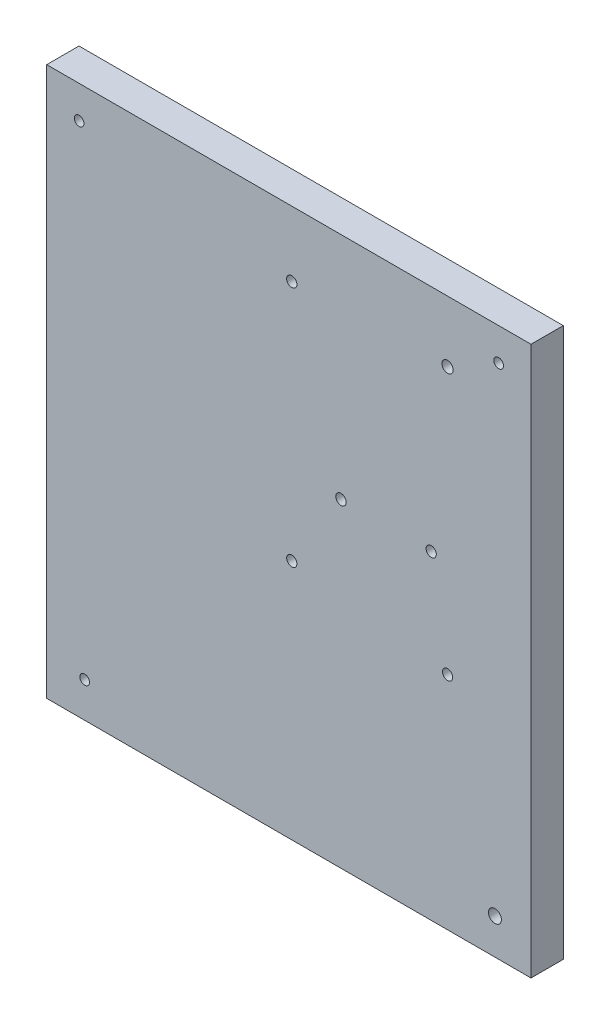
ISO-10303-21;
HEADER;
FILE_DESCRIPTION(('STEP AP214'),'2;1');
FILE_NAME('part.step','',(''),(''),'','','');
FILE_SCHEMA(('AUTOMOTIVE_DESIGN { 1 0 10303 214 1 1 1 1 }'));
ENDSEC;
DATA;
#1=APPLICATION_CONTEXT('core data for automotive mechanical design processes');
#2=APPLICATION_PROTOCOL_DEFINITION('international standard','automotive_design',2000,#1);
#3=PRODUCT_CONTEXT('',#1,'mechanical');
#4=PRODUCT('Part','Part','',(#3));
#5=PRODUCT_RELATED_PRODUCT_CATEGORY('part','',(#4));
#6=PRODUCT_DEFINITION_FORMATION('','',#4);
#7=PRODUCT_DEFINITION_CONTEXT('part definition',#1,'design');
#8=PRODUCT_DEFINITION('design','',#6,#7);
#9=PRODUCT_DEFINITION_SHAPE('','',#8);
#10=(LENGTH_UNIT() NAMED_UNIT(*) SI_UNIT(.MILLI.,.METRE.));
#11=(NAMED_UNIT(*) PLANE_ANGLE_UNIT() SI_UNIT($,.RADIAN.));
#12=(NAMED_UNIT(*) SI_UNIT($,.STERADIAN.) SOLID_ANGLE_UNIT());
#13=UNCERTAINTY_MEASURE_WITH_UNIT(LENGTH_MEASURE(1.E-05),#10,'distance_accuracy_value','');
#14=(GEOMETRIC_REPRESENTATION_CONTEXT(3) GLOBAL_UNCERTAINTY_ASSIGNED_CONTEXT((#13)) GLOBAL_UNIT_ASSIGNED_CONTEXT((#10,
#11,#12)) REPRESENTATION_CONTEXT('',''));
#15=CARTESIAN_POINT('',(0.,0.,0.));
#16=DIRECTION('',(0.,0.,1.));
#17=DIRECTION('',(1.,0.,0.));
#18=AXIS2_PLACEMENT_3D('',#15,#16,#17);
#19=CARTESIAN_POINT('',(0.,0.,10.));
#20=DIRECTION('',(0.,0.,-1.));
#21=DIRECTION('',(-1.,0.,0.));
#22=AXIS2_PLACEMENT_3D('',#19,#20,#21);
#23=PLANE('',#22);
#24=CARTESIAN_POINT('',(124.162413192592,68.48,10.));
#25=DIRECTION('',(0.,0.,-1.));
#26=DIRECTION('',(-1.,0.,0.));
#27=AXIS2_PLACEMENT_3D('',#24,#25,#26);
#28=CIRCLE('',#27,1.58750000000003);
#29=CARTESIAN_POINT('',(122.574913192592,68.48,10.));
#30=VERTEX_POINT('',#29);
#31=EDGE_CURVE('E158',#30,#30,#28,.F.);
#32=ORIENTED_EDGE('',*,*,#31,.F.);
#33=EDGE_LOOP('',(#32));
#34=FACE_BOUND('',#33,.T.);
#35=CARTESIAN_POINT('',(119.082413192592,98.96,10.));
#36=DIRECTION('',(0.,0.,-1.));
#37=DIRECTION('',(-1.,0.,0.));
#38=AXIS2_PLACEMENT_3D('',#35,#36,#37);
#39=CIRCLE('',#38,1.58750000000001);
#40=CARTESIAN_POINT('',(117.494913192592,98.96,10.));
#41=VERTEX_POINT('',#40);
#42=EDGE_CURVE('E146',#41,#41,#39,.F.);
#43=ORIENTED_EDGE('',*,*,#42,.F.);
#44=EDGE_LOOP('',(#43));
#45=FACE_BOUND('',#44,.T.);
#46=CARTESIAN_POINT('',(75.9024131925925,149.76,10.));
#47=DIRECTION('',(0.,0.,-1.));
#48=DIRECTION('',(-1.,0.,0.));
#49=AXIS2_PLACEMENT_3D('',#46,#47,#48);
#50=CIRCLE('',#49,1.58749999999999);
#51=CARTESIAN_POINT('',(74.3149131925925,149.76,10.));
#52=VERTEX_POINT('',#51);
#53=EDGE_CURVE('E134',#52,#52,#50,.F.);
#54=ORIENTED_EDGE('',*,*,#53,.F.);
#55=EDGE_LOOP('',(#54));
#56=FACE_BOUND('',#55,.T.);
#57=CARTESIAN_POINT('',(138.83014603639,11.0362916621417,10.));
#58=DIRECTION('',(0.,0.,-1.));
#59=DIRECTION('',(-1.,0.,0.));
#60=AXIS2_PLACEMENT_3D('',#57,#58,#59);
#61=CIRCLE('',#60,1.99760493715462);
#62=CARTESIAN_POINT('',(136.832541099236,11.0362916621417,10.));
#63=VERTEX_POINT('',#62);
#64=EDGE_CURVE('E122',#63,#63,#61,.F.);
#65=ORIENTED_EDGE('',*,*,#64,.F.);
#66=EDGE_LOOP('',(#65));
#67=FACE_BOUND('',#66,.T.);
#68=CARTESIAN_POINT('',(10.0330293163896,159.940212919892,10.));
#69=DIRECTION('',(0.,0.,-1.));
#70=DIRECTION('',(-1.,0.,0.));
#71=AXIS2_PLACEMENT_3D('',#68,#69,#70);
#72=CIRCLE('',#71,1.5);
#73=CARTESIAN_POINT('',(8.53302931638961,159.940212919892,10.));
#74=VERTEX_POINT('',#73);
#75=EDGE_CURVE('E99',#74,#74,#72,.F.);
#76=ORIENTED_EDGE('',*,*,#75,.F.);
#77=EDGE_LOOP('',(#76));
#78=FACE_BOUND('',#77,.T.);
#79=DIRECTION('',(0.,-1.,0.));
#80=VECTOR('',#79,1.);
#81=CARTESIAN_POINT('',(0.,0.,10.));
#82=LINE('',#81,#80);
#83=CARTESIAN_POINT('',(0.,170.,10.));
#84=VERTEX_POINT('',#83);
#85=CARTESIAN_POINT('',(0.,0.,10.));
#86=VERTEX_POINT('',#85);
#87=EDGE_CURVE('E84',#84,#86,#82,.T.);
#88=ORIENTED_EDGE('',*,*,#87,.T.);
#89=DIRECTION('',(1.,0.,0.));
#90=VECTOR('',#89,1.);
#91=CARTESIAN_POINT('',(0.,0.,10.));
#92=LINE('',#91,#90);
#93=CARTESIAN_POINT('',(150.,0.,10.));
#94=VERTEX_POINT('',#93);
#95=EDGE_CURVE('E79',#86,#94,#92,.T.);
#96=ORIENTED_EDGE('',*,*,#95,.T.);
#97=DIRECTION('',(0.,1.,0.));
#98=VECTOR('',#97,1.);
#99=CARTESIAN_POINT('',(150.,0.,10.));
#100=LINE('',#99,#98);
#101=CARTESIAN_POINT('',(150.,170.,10.));
#102=VERTEX_POINT('',#101);
#103=EDGE_CURVE('E82',#94,#102,#100,.T.);
#104=ORIENTED_EDGE('',*,*,#103,.T.);
#105=DIRECTION('',(-1.,0.,0.));
#106=VECTOR('',#105,1.);
#107=CARTESIAN_POINT('',(0.,170.,10.));
#108=LINE('',#107,#106);
#109=EDGE_CURVE('E49',#102,#84,#108,.T.);
#110=ORIENTED_EDGE('',*,*,#109,.T.);
#111=EDGE_LOOP('',(#88,#96,#104,#110));
#112=FACE_BOUND('',#111,.T.);
#113=CARTESIAN_POINT('',(139.978914047077,159.940212919892,10.));
#114=DIRECTION('',(0.,0.,-1.));
#115=DIRECTION('',(-1.,0.,0.));
#116=AXIS2_PLACEMENT_3D('',#113,#114,#115);
#117=CIRCLE('',#116,1.5);
#118=CARTESIAN_POINT('',(138.478914047077,159.940212919892,10.));
#119=VERTEX_POINT('',#118);
#120=EDGE_CURVE('E116',#119,#119,#117,.F.);
#121=ORIENTED_EDGE('',*,*,#120,.F.);
#122=EDGE_LOOP('',(#121));
#123=FACE_BOUND('',#122,.T.);
#124=CARTESIAN_POINT('',(11.7556994308777,10.9268338372165,10.));
#125=DIRECTION('',(0.,0.,-1.));
#126=DIRECTION('',(-1.,0.,0.));
#127=AXIS2_PLACEMENT_3D('',#124,#125,#126);
#128=CIRCLE('',#127,1.5);
#129=CARTESIAN_POINT('',(10.2556994308777,10.9268338372165,10.));
#130=VERTEX_POINT('',#129);
#131=EDGE_CURVE('E128',#130,#130,#128,.F.);
#132=ORIENTED_EDGE('',*,*,#131,.F.);
#133=EDGE_LOOP('',(#132));
#134=FACE_BOUND('',#133,.T.);
#135=CARTESIAN_POINT('',(124.162413192592,151.03,10.));
#136=DIRECTION('',(0.,0.,-1.));
#137=DIRECTION('',(-1.,0.,0.));
#138=AXIS2_PLACEMENT_3D('',#135,#136,#137);
#139=CIRCLE('',#138,1.73833982041641);
#140=CARTESIAN_POINT('',(122.424073372176,151.03,10.));
#141=VERTEX_POINT('',#140);
#142=EDGE_CURVE('E140',#141,#141,#139,.F.);
#143=ORIENTED_EDGE('',*,*,#142,.F.);
#144=EDGE_LOOP('',(#143));
#145=FACE_BOUND('',#144,.T.);
#146=CARTESIAN_POINT('',(91.1424131925924,98.96,10.));
#147=DIRECTION('',(0.,0.,-1.));
#148=DIRECTION('',(-1.,0.,0.));
#149=AXIS2_PLACEMENT_3D('',#146,#147,#148);
#150=CIRCLE('',#149,1.6200555073619);
#151=CARTESIAN_POINT('',(89.5223576852305,98.96,10.));
#152=VERTEX_POINT('',#151);
#153=EDGE_CURVE('E152',#152,#152,#150,.F.);
#154=ORIENTED_EDGE('',*,*,#153,.F.);
#155=EDGE_LOOP('',(#154));
#156=FACE_BOUND('',#155,.T.);
#157=CARTESIAN_POINT('',(75.9024131925925,74.83,10.));
#158=DIRECTION('',(0.,0.,-1.));
#159=DIRECTION('',(-1.,0.,0.));
#160=AXIS2_PLACEMENT_3D('',#157,#158,#159);
#161=CIRCLE('',#160,1.5875);
#162=CARTESIAN_POINT('',(74.3149131925925,74.83,10.));
#163=VERTEX_POINT('',#162);
#164=EDGE_CURVE('E164',#163,#163,#161,.F.);
#165=ORIENTED_EDGE('',*,*,#164,.F.);
#166=EDGE_LOOP('',(#165));
#167=FACE_BOUND('',#166,.T.);
#168=ADVANCED_FACE('F32',(#34,#45,#56,#67,#78,#112,#123,#134,#145,#156,#167),#23,.F.);
#169=CARTESIAN_POINT('',(0.,0.,0.));
#170=DIRECTION('',(0.,0.,-1.));
#171=DIRECTION('',(-1.,0.,0.));
#172=AXIS2_PLACEMENT_3D('',#169,#170,#171);
#173=PLANE('',#172);
#174=CARTESIAN_POINT('',(124.162413192592,68.48,0.));
#175=DIRECTION('',(0.,0.,1.));
#176=DIRECTION('',(1.,0.,0.));
#177=AXIS2_PLACEMENT_3D('',#174,#175,#176);
#178=CIRCLE('',#177,1.58750000000003);
#179=CARTESIAN_POINT('',(125.749913192592,68.48,0.));
#180=VERTEX_POINT('',#179);
#181=EDGE_CURVE('E161',#180,#180,#178,.T.);
#182=ORIENTED_EDGE('',*,*,#181,.T.);
#183=EDGE_LOOP('',(#182));
#184=FACE_BOUND('',#183,.T.);
#185=CARTESIAN_POINT('',(119.082413192592,98.96,0.));
#186=DIRECTION('',(0.,0.,1.));
#187=DIRECTION('',(1.,0.,0.));
#188=AXIS2_PLACEMENT_3D('',#185,#186,#187);
#189=CIRCLE('',#188,1.58750000000001);
#190=CARTESIAN_POINT('',(120.669913192592,98.96,0.));
#191=VERTEX_POINT('',#190);
#192=EDGE_CURVE('E149',#191,#191,#189,.T.);
#193=ORIENTED_EDGE('',*,*,#192,.T.);
#194=EDGE_LOOP('',(#193));
#195=FACE_BOUND('',#194,.T.);
#196=CARTESIAN_POINT('',(75.9024131925925,149.76,0.));
#197=DIRECTION('',(0.,0.,1.));
#198=DIRECTION('',(1.,0.,0.));
#199=AXIS2_PLACEMENT_3D('',#196,#197,#198);
#200=CIRCLE('',#199,1.58749999999999);
#201=CARTESIAN_POINT('',(77.4899131925925,149.76,0.));
#202=VERTEX_POINT('',#201);
#203=EDGE_CURVE('E137',#202,#202,#200,.T.);
#204=ORIENTED_EDGE('',*,*,#203,.T.);
#205=EDGE_LOOP('',(#204));
#206=FACE_BOUND('',#205,.T.);
#207=CARTESIAN_POINT('',(138.83014603639,11.0362916621417,0.));
#208=DIRECTION('',(0.,0.,1.));
#209=DIRECTION('',(1.,0.,0.));
#210=AXIS2_PLACEMENT_3D('',#207,#208,#209);
#211=CIRCLE('',#210,1.99760493715462);
#212=CARTESIAN_POINT('',(140.827750973545,11.0362916621417,0.));
#213=VERTEX_POINT('',#212);
#214=EDGE_CURVE('E125',#213,#213,#211,.T.);
#215=ORIENTED_EDGE('',*,*,#214,.T.);
#216=EDGE_LOOP('',(#215));
#217=FACE_BOUND('',#216,.T.);
#218=CARTESIAN_POINT('',(10.0330293163896,159.940212919892,0.));
#219=DIRECTION('',(0.,0.,1.));
#220=DIRECTION('',(1.,0.,0.));
#221=AXIS2_PLACEMENT_3D('',#218,#219,#220);
#222=CIRCLE('',#221,1.5);
#223=CARTESIAN_POINT('',(11.5330293163896,159.940212919892,0.));
#224=VERTEX_POINT('',#223);
#225=EDGE_CURVE('E113',#224,#224,#222,.T.);
#226=ORIENTED_EDGE('',*,*,#225,.T.);
#227=EDGE_LOOP('',(#226));
#228=FACE_BOUND('',#227,.T.);
#229=DIRECTION('',(0.,-1.,0.));
#230=VECTOR('',#229,1.);
#231=CARTESIAN_POINT('',(0.,0.,0.));
#232=LINE('',#231,#230);
#233=CARTESIAN_POINT('',(0.,170.,0.));
#234=VERTEX_POINT('',#233);
#235=CARTESIAN_POINT('',(0.,0.,0.));
#236=VERTEX_POINT('',#235);
#237=EDGE_CURVE('E96',#234,#236,#232,.T.);
#238=ORIENTED_EDGE('',*,*,#237,.F.);
#239=DIRECTION('',(-1.,0.,0.));
#240=VECTOR('',#239,1.);
#241=CARTESIAN_POINT('',(0.,170.,0.));
#242=LINE('',#241,#240);
#243=CARTESIAN_POINT('',(150.,170.,0.));
#244=VERTEX_POINT('',#243);
#245=EDGE_CURVE('E72',#244,#234,#242,.T.);
#246=ORIENTED_EDGE('',*,*,#245,.F.);
#247=DIRECTION('',(0.,1.,0.));
#248=VECTOR('',#247,1.);
#249=CARTESIAN_POINT('',(150.,0.,0.));
#250=LINE('',#249,#248);
#251=CARTESIAN_POINT('',(150.,0.,0.));
#252=VERTEX_POINT('',#251);
#253=EDGE_CURVE('E66',#252,#244,#250,.T.);
#254=ORIENTED_EDGE('',*,*,#253,.F.);
#255=DIRECTION('',(1.,0.,0.));
#256=VECTOR('',#255,1.);
#257=CARTESIAN_POINT('',(0.,0.,0.));
#258=LINE('',#257,#256);
#259=EDGE_CURVE('E88',#236,#252,#258,.T.);
#260=ORIENTED_EDGE('',*,*,#259,.F.);
#261=EDGE_LOOP('',(#238,#246,#254,#260));
#262=FACE_BOUND('',#261,.T.);
#263=CARTESIAN_POINT('',(139.978914047077,159.940212919892,0.));
#264=DIRECTION('',(0.,0.,1.));
#265=DIRECTION('',(1.,0.,0.));
#266=AXIS2_PLACEMENT_3D('',#263,#264,#265);
#267=CIRCLE('',#266,1.5);
#268=CARTESIAN_POINT('',(141.478914047077,159.940212919892,0.));
#269=VERTEX_POINT('',#268);
#270=EDGE_CURVE('E119',#269,#269,#267,.T.);
#271=ORIENTED_EDGE('',*,*,#270,.T.);
#272=EDGE_LOOP('',(#271));
#273=FACE_BOUND('',#272,.T.);
#274=CARTESIAN_POINT('',(11.7556994308777,10.9268338372165,0.));
#275=DIRECTION('',(0.,0.,1.));
#276=DIRECTION('',(1.,0.,0.));
#277=AXIS2_PLACEMENT_3D('',#274,#275,#276);
#278=CIRCLE('',#277,1.5);
#279=CARTESIAN_POINT('',(13.2556994308777,10.9268338372165,0.));
#280=VERTEX_POINT('',#279);
#281=EDGE_CURVE('E131',#280,#280,#278,.T.);
#282=ORIENTED_EDGE('',*,*,#281,.T.);
#283=EDGE_LOOP('',(#282));
#284=FACE_BOUND('',#283,.T.);
#285=CARTESIAN_POINT('',(124.162413192592,151.03,0.));
#286=DIRECTION('',(0.,0.,1.));
#287=DIRECTION('',(1.,0.,0.));
#288=AXIS2_PLACEMENT_3D('',#285,#286,#287);
#289=CIRCLE('',#288,1.73833982041641);
#290=CARTESIAN_POINT('',(125.900753013009,151.03,0.));
#291=VERTEX_POINT('',#290);
#292=EDGE_CURVE('E143',#291,#291,#289,.T.);
#293=ORIENTED_EDGE('',*,*,#292,.T.);
#294=EDGE_LOOP('',(#293));
#295=FACE_BOUND('',#294,.T.);
#296=CARTESIAN_POINT('',(91.1424131925924,98.96,0.));
#297=DIRECTION('',(0.,0.,1.));
#298=DIRECTION('',(1.,0.,0.));
#299=AXIS2_PLACEMENT_3D('',#296,#297,#298);
#300=CIRCLE('',#299,1.6200555073619);
#301=CARTESIAN_POINT('',(92.7624686999543,98.96,0.));
#302=VERTEX_POINT('',#301);
#303=EDGE_CURVE('E155',#302,#302,#300,.T.);
#304=ORIENTED_EDGE('',*,*,#303,.T.);
#305=EDGE_LOOP('',(#304));
#306=FACE_BOUND('',#305,.T.);
#307=CARTESIAN_POINT('',(75.9024131925925,74.83,0.));
#308=DIRECTION('',(0.,0.,1.));
#309=DIRECTION('',(1.,0.,0.));
#310=AXIS2_PLACEMENT_3D('',#307,#308,#309);
#311=CIRCLE('',#310,1.5875);
#312=CARTESIAN_POINT('',(77.4899131925925,74.83,0.));
#313=VERTEX_POINT('',#312);
#314=EDGE_CURVE('E167',#313,#313,#311,.T.);
#315=ORIENTED_EDGE('',*,*,#314,.T.);
#316=EDGE_LOOP('',(#315));
#317=FACE_BOUND('',#316,.T.);
#318=ADVANCED_FACE('F107',(#184,#195,#206,#217,#228,#262,#273,#284,#295,#306,#317),#173,.T.);
#319=CARTESIAN_POINT('',(0.,0.,10.));
#320=DIRECTION('',(1.,0.,0.));
#321=DIRECTION('',(0.,0.,-1.));
#322=AXIS2_PLACEMENT_3D('',#319,#320,#321);
#323=PLANE('',#322);
#324=ORIENTED_EDGE('',*,*,#237,.T.);
#325=DIRECTION('',(0.,0.,-1.));
#326=VECTOR('',#325,1.);
#327=CARTESIAN_POINT('',(0.,0.,10.));
#328=LINE('',#327,#326);
#329=EDGE_CURVE('E11',#86,#236,#328,.T.);
#330=ORIENTED_EDGE('',*,*,#329,.F.);
#331=ORIENTED_EDGE('',*,*,#87,.F.);
#332=DIRECTION('',(0.,0.,-1.));
#333=VECTOR('',#332,1.);
#334=CARTESIAN_POINT('',(0.,170.,10.));
#335=LINE('',#334,#333);
#336=EDGE_CURVE('E92',#84,#234,#335,.T.);
#337=ORIENTED_EDGE('',*,*,#336,.T.);
#338=EDGE_LOOP('',(#324,#330,#331,#337));
#339=FACE_BOUND('',#338,.T.);
#340=ADVANCED_FACE('F34',(#339),#323,.F.);
#341=CARTESIAN_POINT('',(0.,0.,10.));
#342=DIRECTION('',(0.,1.,0.));
#343=DIRECTION('',(0.,0.,1.));
#344=AXIS2_PLACEMENT_3D('',#341,#342,#343);
#345=PLANE('',#344);
#346=ORIENTED_EDGE('',*,*,#259,.T.);
#347=DIRECTION('',(0.,0.,-1.));
#348=VECTOR('',#347,1.);
#349=CARTESIAN_POINT('',(150.,0.,10.));
#350=LINE('',#349,#348);
#351=EDGE_CURVE('E41',#94,#252,#350,.T.);
#352=ORIENTED_EDGE('',*,*,#351,.F.);
#353=ORIENTED_EDGE('',*,*,#95,.F.);
#354=ORIENTED_EDGE('',*,*,#329,.T.);
#355=EDGE_LOOP('',(#346,#352,#353,#354));
#356=FACE_BOUND('',#355,.T.);
#357=ADVANCED_FACE('F87',(#356),#345,.F.);
#358=CARTESIAN_POINT('',(150.,0.,10.));
#359=DIRECTION('',(-1.,0.,0.));
#360=DIRECTION('',(0.,0.,1.));
#361=AXIS2_PLACEMENT_3D('',#358,#359,#360);
#362=PLANE('',#361);
#363=ORIENTED_EDGE('',*,*,#253,.T.);
#364=DIRECTION('',(0.,0.,-1.));
#365=VECTOR('',#364,1.);
#366=CARTESIAN_POINT('',(150.,170.,10.));
#367=LINE('',#366,#365);
#368=EDGE_CURVE('E89',#102,#244,#367,.T.);
#369=ORIENTED_EDGE('',*,*,#368,.F.);
#370=ORIENTED_EDGE('',*,*,#103,.F.);
#371=ORIENTED_EDGE('',*,*,#351,.T.);
#372=EDGE_LOOP('',(#363,#369,#370,#371));
#373=FACE_BOUND('',#372,.T.);
#374=ADVANCED_FACE('F90',(#373),#362,.F.);
#375=CARTESIAN_POINT('',(0.,170.,10.));
#376=DIRECTION('',(0.,-1.,0.));
#377=DIRECTION('',(0.,0.,-1.));
#378=AXIS2_PLACEMENT_3D('',#375,#376,#377);
#379=PLANE('',#378);
#380=ORIENTED_EDGE('',*,*,#245,.T.);
#381=ORIENTED_EDGE('',*,*,#336,.F.);
#382=ORIENTED_EDGE('',*,*,#109,.F.);
#383=ORIENTED_EDGE('',*,*,#368,.T.);
#384=EDGE_LOOP('',(#380,#381,#382,#383));
#385=FACE_BOUND('',#384,.T.);
#386=ADVANCED_FACE('F104',(#385),#379,.F.);
#387=CARTESIAN_POINT('',(10.0330293163896,159.940212919892,46.));
#388=DIRECTION('',(0.,0.,-1.));
#389=DIRECTION('',(-1.,0.,0.));
#390=AXIS2_PLACEMENT_3D('',#387,#388,#389);
#391=CYLINDRICAL_SURFACE('',#390,1.5);
#392=ORIENTED_EDGE('',*,*,#225,.F.);
#393=EDGE_LOOP('',(#392));
#394=FACE_BOUND('',#393,.T.);
#395=ORIENTED_EDGE('',*,*,#75,.T.);
#396=EDGE_LOOP('',(#395));
#397=FACE_BOUND('',#396,.T.);
#398=ADVANCED_FACE('F191',(#394,#397),#391,.F.);
#399=CARTESIAN_POINT('',(139.978914047077,159.940212919892,46.));
#400=DIRECTION('',(0.,0.,-1.));
#401=DIRECTION('',(-1.,0.,0.));
#402=AXIS2_PLACEMENT_3D('',#399,#400,#401);
#403=CYLINDRICAL_SURFACE('',#402,1.5);
#404=ORIENTED_EDGE('',*,*,#270,.F.);
#405=EDGE_LOOP('',(#404));
#406=FACE_BOUND('',#405,.T.);
#407=ORIENTED_EDGE('',*,*,#120,.T.);
#408=EDGE_LOOP('',(#407));
#409=FACE_BOUND('',#408,.T.);
#410=ADVANCED_FACE('F237',(#406,#409),#403,.F.);
#411=CARTESIAN_POINT('',(138.83014603639,11.0362916621417,46.));
#412=DIRECTION('',(0.,0.,-1.));
#413=DIRECTION('',(-1.,0.,0.));
#414=AXIS2_PLACEMENT_3D('',#411,#412,#413);
#415=CYLINDRICAL_SURFACE('',#414,1.99760493715462);
#416=ORIENTED_EDGE('',*,*,#214,.F.);
#417=EDGE_LOOP('',(#416));
#418=FACE_BOUND('',#417,.T.);
#419=ORIENTED_EDGE('',*,*,#64,.T.);
#420=EDGE_LOOP('',(#419));
#421=FACE_BOUND('',#420,.T.);
#422=ADVANCED_FACE('F243',(#418,#421),#415,.F.);
#423=CARTESIAN_POINT('',(11.7556994308777,10.9268338372165,46.));
#424=DIRECTION('',(0.,0.,-1.));
#425=DIRECTION('',(-1.,0.,0.));
#426=AXIS2_PLACEMENT_3D('',#423,#424,#425);
#427=CYLINDRICAL_SURFACE('',#426,1.5);
#428=ORIENTED_EDGE('',*,*,#281,.F.);
#429=EDGE_LOOP('',(#428));
#430=FACE_BOUND('',#429,.T.);
#431=ORIENTED_EDGE('',*,*,#131,.T.);
#432=EDGE_LOOP('',(#431));
#433=FACE_BOUND('',#432,.T.);
#434=ADVANCED_FACE('F250',(#430,#433),#427,.F.);
#435=CARTESIAN_POINT('',(75.9024131925925,149.76,46.));
#436=DIRECTION('',(0.,0.,-1.));
#437=DIRECTION('',(-1.,0.,0.));
#438=AXIS2_PLACEMENT_3D('',#435,#436,#437);
#439=CYLINDRICAL_SURFACE('',#438,1.58749999999999);
#440=ORIENTED_EDGE('',*,*,#203,.F.);
#441=EDGE_LOOP('',(#440));
#442=FACE_BOUND('',#441,.T.);
#443=ORIENTED_EDGE('',*,*,#53,.T.);
#444=EDGE_LOOP('',(#443));
#445=FACE_BOUND('',#444,.T.);
#446=ADVANCED_FACE('F258',(#442,#445),#439,.F.);
#447=CARTESIAN_POINT('',(124.162413192592,151.03,46.));
#448=DIRECTION('',(0.,0.,-1.));
#449=DIRECTION('',(-1.,0.,0.));
#450=AXIS2_PLACEMENT_3D('',#447,#448,#449);
#451=CYLINDRICAL_SURFACE('',#450,1.73833982041641);
#452=ORIENTED_EDGE('',*,*,#292,.F.);
#453=EDGE_LOOP('',(#452));
#454=FACE_BOUND('',#453,.T.);
#455=ORIENTED_EDGE('',*,*,#142,.T.);
#456=EDGE_LOOP('',(#455));
#457=FACE_BOUND('',#456,.T.);
#458=ADVANCED_FACE('F266',(#454,#457),#451,.F.);
#459=CARTESIAN_POINT('',(119.082413192592,98.96,46.));
#460=DIRECTION('',(0.,0.,-1.));
#461=DIRECTION('',(-1.,0.,0.));
#462=AXIS2_PLACEMENT_3D('',#459,#460,#461);
#463=CYLINDRICAL_SURFACE('',#462,1.58750000000001);
#464=ORIENTED_EDGE('',*,*,#192,.F.);
#465=EDGE_LOOP('',(#464));
#466=FACE_BOUND('',#465,.T.);
#467=ORIENTED_EDGE('',*,*,#42,.T.);
#468=EDGE_LOOP('',(#467));
#469=FACE_BOUND('',#468,.T.);
#470=ADVANCED_FACE('F274',(#466,#469),#463,.F.);
#471=CARTESIAN_POINT('',(91.1424131925924,98.96,46.));
#472=DIRECTION('',(0.,0.,-1.));
#473=DIRECTION('',(-1.,0.,0.));
#474=AXIS2_PLACEMENT_3D('',#471,#472,#473);
#475=CYLINDRICAL_SURFACE('',#474,1.6200555073619);
#476=ORIENTED_EDGE('',*,*,#303,.F.);
#477=EDGE_LOOP('',(#476));
#478=FACE_BOUND('',#477,.T.);
#479=ORIENTED_EDGE('',*,*,#153,.T.);
#480=EDGE_LOOP('',(#479));
#481=FACE_BOUND('',#480,.T.);
#482=ADVANCED_FACE('F282',(#478,#481),#475,.F.);
#483=CARTESIAN_POINT('',(124.162413192592,68.48,46.));
#484=DIRECTION('',(0.,0.,-1.));
#485=DIRECTION('',(-1.,0.,0.));
#486=AXIS2_PLACEMENT_3D('',#483,#484,#485);
#487=CYLINDRICAL_SURFACE('',#486,1.58750000000003);
#488=ORIENTED_EDGE('',*,*,#181,.F.);
#489=EDGE_LOOP('',(#488));
#490=FACE_BOUND('',#489,.T.);
#491=ORIENTED_EDGE('',*,*,#31,.T.);
#492=EDGE_LOOP('',(#491));
#493=FACE_BOUND('',#492,.T.);
#494=ADVANCED_FACE('F175',(#490,#493),#487,.F.);
#495=CARTESIAN_POINT('',(75.9024131925925,74.83,46.));
#496=DIRECTION('',(0.,0.,-1.));
#497=DIRECTION('',(-1.,0.,0.));
#498=AXIS2_PLACEMENT_3D('',#495,#496,#497);
#499=CYLINDRICAL_SURFACE('',#498,1.5875);
#500=ORIENTED_EDGE('',*,*,#314,.F.);
#501=EDGE_LOOP('',(#500));
#502=FACE_BOUND('',#501,.T.);
#503=ORIENTED_EDGE('',*,*,#164,.T.);
#504=EDGE_LOOP('',(#503));
#505=FACE_BOUND('',#504,.T.);
#506=ADVANCED_FACE('F172',(#502,#505),#499,.F.);
#507=CLOSED_SHELL('',(#168,#318,#340,#357,#374,#386,#398,#410,#422,#434,#446,#458,#470,#482,
#494,#506));
#508=MANIFOLD_SOLID_BREP('B2',#507);
#509=ADVANCED_BREP_SHAPE_REPRESENTATION('',(#18,#508),#14);
#510=SHAPE_DEFINITION_REPRESENTATION(#9,#509);
ENDSEC;
END-ISO-10303-21;
